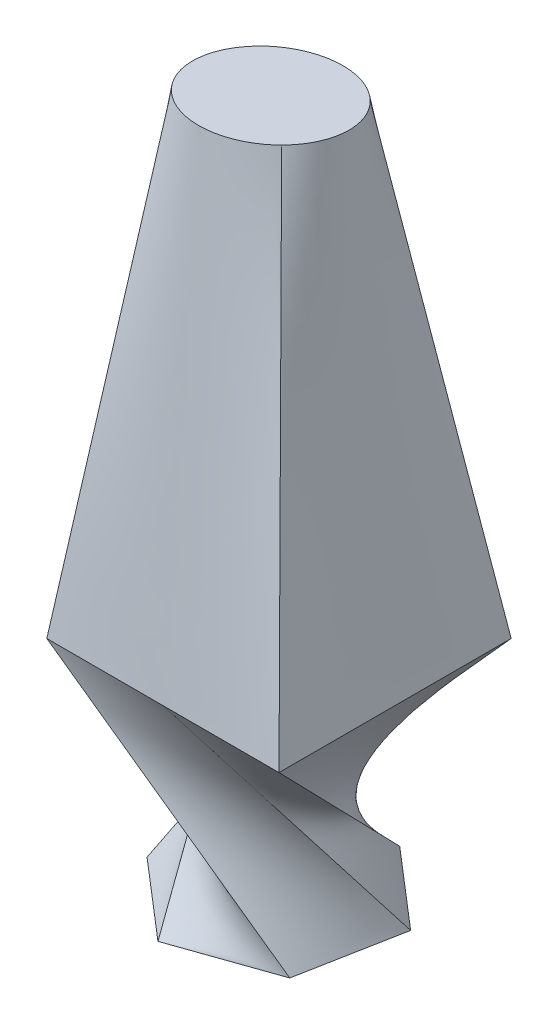
ISO-10303-21;
HEADER;
FILE_DESCRIPTION(('STEP AP214'),'2;1');
FILE_NAME('part.step','',(''),(''),'','','');
FILE_SCHEMA(('AUTOMOTIVE_DESIGN { 1 0 10303 214 1 1 1 1 }'));
ENDSEC;
DATA;
#1=APPLICATION_CONTEXT('core data for automotive mechanical design processes');
#2=APPLICATION_PROTOCOL_DEFINITION('international standard','automotive_design',2000,#1);
#3=PRODUCT_CONTEXT('',#1,'mechanical');
#4=PRODUCT('Part','Part','',(#3));
#5=PRODUCT_RELATED_PRODUCT_CATEGORY('part','',(#4));
#6=PRODUCT_DEFINITION_FORMATION('','',#4);
#7=PRODUCT_DEFINITION_CONTEXT('part definition',#1,'design');
#8=PRODUCT_DEFINITION('design','',#6,#7);
#9=PRODUCT_DEFINITION_SHAPE('','',#8);
#10=(LENGTH_UNIT() NAMED_UNIT(*) SI_UNIT(.MILLI.,.METRE.));
#11=(NAMED_UNIT(*) PLANE_ANGLE_UNIT() SI_UNIT($,.RADIAN.));
#12=(NAMED_UNIT(*) SI_UNIT($,.STERADIAN.) SOLID_ANGLE_UNIT());
#13=UNCERTAINTY_MEASURE_WITH_UNIT(LENGTH_MEASURE(1.E-05),#10,'distance_accuracy_value','');
#14=(GEOMETRIC_REPRESENTATION_CONTEXT(3) GLOBAL_UNCERTAINTY_ASSIGNED_CONTEXT((#13)) GLOBAL_UNIT_ASSIGNED_CONTEXT((#10,
#11,#12)) REPRESENTATION_CONTEXT('',''));
#15=CARTESIAN_POINT('',(0.,0.,0.));
#16=DIRECTION('',(0.,0.,1.));
#17=DIRECTION('',(1.,0.,0.));
#18=AXIS2_PLACEMENT_3D('',#15,#16,#17);
#19=CARTESIAN_POINT('',(5.75967949876772,100.,2.47246973523809));
#20=DIRECTION('',(0.,1.,0.));
#21=DIRECTION('',(0.,0.,1.));
#22=AXIS2_PLACEMENT_3D('',#19,#20,#21);
#23=PLANE('',#22);
#24=CARTESIAN_POINT('',(5.75967949876772,100.,2.47246973523809));
#25=DIRECTION('',(0.,1.,0.));
#26=DIRECTION('',(0.892827172879667,0.,-0.450399422033046));
#27=AXIS2_PLACEMENT_3D('',#24,#25,#26);
#28=ELLIPSE('',#27,15.3774135941659,12.7880862975647);
#29=CARTESIAN_POINT('',(-4.65101371843553,100.,-5.59238115716315));
#30=VERTEX_POINT('',#29);
#31=CARTESIAN_POINT('',(-5.96029484084761,100.,12.1687105106719));
#32=VERTEX_POINT('',#31);
#33=EDGE_CURVE('E107',#30,#32,#28,.T.);
#34=ORIENTED_EDGE('',*,*,#33,.T.);
#35=CARTESIAN_POINT('',(16.170372715971,100.,10.5373206276393));
#36=VERTEX_POINT('',#35);
#37=EDGE_CURVE('E252',#32,#36,#28,.T.);
#38=ORIENTED_EDGE('',*,*,#37,.T.);
#39=CARTESIAN_POINT('',(17.479653838383,100.,-7.2237710401957));
#40=VERTEX_POINT('',#39);
#41=EDGE_CURVE('E244',#36,#40,#28,.T.);
#42=ORIENTED_EDGE('',*,*,#41,.T.);
#43=EDGE_CURVE('E253',#40,#30,#28,.T.);
#44=ORIENTED_EDGE('',*,*,#43,.T.);
#45=EDGE_LOOP('',(#34,#38,#42,#44));
#46=FACE_BOUND('',#45,.T.);
#47=ADVANCED_FACE('F79',(#46),#23,.T.);
#48=CARTESIAN_POINT('',(16.170372715971,100.,10.5373206276393));
#49=CARTESIAN_POINT('',(32.9094123068504,0.,27.8481012658228));
#50=CARTESIAN_POINT('',(15.5097309400779,100.,11.1979624035324));
#51=CARTESIAN_POINT('',(30.8260789735171,0.,27.8481012658228));
#52=CARTESIAN_POINT('',(14.7604311117545,100.,11.8398617789833));
#53=CARTESIAN_POINT('',(28.7427456401838,0.,27.8481012658228));
#54=CARTESIAN_POINT('',(13.0937994361936,100.,13.0304037317787));
#55=CARTESIAN_POINT('',(24.5760789735172,0.,27.8481012658228));
#56=CARTESIAN_POINT('',(12.1763269192082,100.,13.578646212666));
#57=CARTESIAN_POINT('',(22.4927456401838,0.,27.8481012658228));
#58=CARTESIAN_POINT('',(10.2102410521367,100.,14.5224451618333));
#59=CARTESIAN_POINT('',(18.3260789735172,0.,27.8481012658228));
#60=CARTESIAN_POINT('',(9.16181577734206,100.,14.9174867262341));
#61=CARTESIAN_POINT('',(16.2427456401839,0.,27.8481012658228));
#62=CARTESIAN_POINT('',(6.99879125221362,100.,15.5064411925035));
#63=CARTESIAN_POINT('',(12.0760789735172,0.,27.8481012658228));
#64=CARTESIAN_POINT('',(5.88472911399291,100.,15.6999598269453));
#65=CARTESIAN_POINT('',(9.99274564018388,0.,27.8481012658228));
#66=CARTESIAN_POINT('',(3.6724461422346,100.,15.8630410376347));
#67=CARTESIAN_POINT('',(5.82607897351721,0.,27.8481012658228));
#68=CARTESIAN_POINT('',(2.57489685464184,100.,15.8325541100318));
#69=CARTESIAN_POINT('',(3.74274564018387,0.,27.8481012658228));
#70=CARTESIAN_POINT('',(0.475541222099772,100.,15.5578063367602));
#71=CARTESIAN_POINT('',(-0.423921026482805,0.,27.8481012658228));
#72=CARTESIAN_POINT('',(-0.525780586847373,100.,15.3138644464477));
#73=CARTESIAN_POINT('',(-2.50725435981614,0.,27.8481012658228));
#74=CARTESIAN_POINT('',(-2.37344405170675,100.,14.6512008069388));
#75=CARTESIAN_POINT('',(-6.67392102648283,0.,27.8481012658228));
#76=CARTESIAN_POINT('',(-3.21967190546853,100.,14.2329717083479));
#77=CARTESIAN_POINT('',(-8.75725435981618,0.,27.8481012658228));
#78=CARTESIAN_POINT('',(-4.72803217707021,100.,13.2764782643926));
#79=CARTESIAN_POINT('',(-12.9239210264829,0.,27.8481012658228));
#80=CARTESIAN_POINT('',(-5.39036611135035,100.,12.7386392401691));
#81=CARTESIAN_POINT('',(-15.0072543598162,0.,27.8481012658228));
#82=CARTESIAN_POINT('',(-5.96029484084761,100.,12.1687105106719));
#83=CARTESIAN_POINT('',(-17.0905876931496,0.,27.8481012658228));
#84=B_SPLINE_SURFACE_WITH_KNOTS('',3,1,((#48,#49),(#50,#51),(#52,#53),(#54,#55),(#56,#57),(#58,
#59),(#60,#61),(#62,#63),(#64,#65),(#66,#67),(#68,#69),(#70,#71),(#72,#73),(#74,#75),(#76,#77),
(#78,#79),(#80,#81),(#82,#83)),.UNSPECIFIED.,.F.,.F.,.F.,(4,2,2,2,2,2,2,2,4),(2,2),(0.,0.125,
0.25,0.375,0.5,0.625,0.75,0.875,1.),(0.,1.),.UNSPECIFIED.);
#85=DIRECTION('',(-0.109300698108646,-0.982010981732975,0.153973339084407));
#86=VECTOR('',#85,1.);
#87=CARTESIAN_POINT('',(-11.5254412669986,50.,20.0084058882473));
#88=LINE('',#87,#86);
#89=CARTESIAN_POINT('',(-17.0905876931496,0.,27.8481012658228));
#90=VERTEX_POINT('',#89);
#91=EDGE_CURVE('E270',#32,#90,#88,.T.);
#92=DIRECTION('',(1.,0.,0.));
#93=VECTOR('',#92,1.);
#94=CARTESIAN_POINT('',(-17.0905876931496,0.,27.8481012658228));
#95=LINE('',#94,#93);
#96=CARTESIAN_POINT('',(7.90941230685039,0.,27.8481012658228));
#97=VERTEX_POINT('',#96);
#98=EDGE_CURVE('E335',#90,#97,#95,.T.);
#99=DIRECTION('',(-1.,0.,0.));
#100=VECTOR('',#99,1.);
#101=CARTESIAN_POINT('',(-17.0905876931496,0.,27.8481012658228));
#102=LINE('',#101,#100);
#103=CARTESIAN_POINT('',(32.9094123068504,0.,27.8481012658228));
#104=VERTEX_POINT('',#103);
#105=EDGE_CURVE('E182',#104,#97,#102,.T.);
#106=DIRECTION('',(-0.162738611193536,0.972209966467892,-0.168297134637814));
#107=VECTOR('',#106,1.);
#108=CARTESIAN_POINT('',(24.5398925114107,50.,19.1927109467311));
#109=LINE('',#108,#107);
#110=EDGE_CURVE('E268',#104,#36,#109,.T.);
#111=ORIENTED_EDGE('',*,*,#37,.F.);
#112=ORIENTED_EDGE('',*,*,#91,.T.);
#113=ORIENTED_EDGE('',*,*,#98,.T.);
#114=ORIENTED_EDGE('',*,*,#105,.F.);
#115=ORIENTED_EDGE('',*,*,#110,.T.);
#116=EDGE_LOOP('',(#111,#112,#113,#114,#115));
#117=FACE_BOUND('',#116,.T.);
#118=ADVANCED_FACE('F221',(#117),#84,.T.);
#119=CARTESIAN_POINT('',(-5.96029484084761,100.,12.1687105106719));
#120=CARTESIAN_POINT('',(-17.0905876931496,0.,27.8481012658228));
#121=CARTESIAN_POINT('',(-6.47086816501145,100.,11.658137186508));
#122=CARTESIAN_POINT('',(-17.0905876931496,0.,25.7647679324894));
#123=CARTESIAN_POINT('',(-6.9433827627682,100.,11.0857564291235));
#124=CARTESIAN_POINT('',(-17.0905876931496,0.,23.6814345991561));
#125=CARTESIAN_POINT('',(-7.77285194402823,100.,9.82483852302612));
#126=CARTESIAN_POINT('',(-17.0905876931496,0.,19.5147679324894));
#127=CARTESIAN_POINT('',(-8.12956002463382,100.,9.13626213958353));
#128=CARTESIAN_POINT('',(-17.0905876931496,0.,17.4314345991561));
#129=CARTESIAN_POINT('',(-8.69144917362927,100.,7.66470101168355));
#130=CARTESIAN_POINT('',(-17.0905876931496,0.,13.2647679324894));
#131=CARTESIAN_POINT('',(-8.89638571463439,100.,6.88180514527687));
#132=CARTESIAN_POINT('',(-17.0905876931496,0.,11.1814345991561));
#133=CARTESIAN_POINT('',(-9.13027929656452,100.,5.25729120726923));
#134=CARTESIAN_POINT('',(-17.0905876931496,0.,7.01476793248939));
#135=CARTESIAN_POINT('',(-9.15909031515034,100.,4.41588950782027));
#136=CARTESIAN_POINT('',(-17.0905876931496,0.,4.93143459915606));
#137=CARTESIAN_POINT('',(-9.03402721919322,100.,2.71934239235783));
#138=CARTESIAN_POINT('',(-17.0905876931496,0.,0.764767932489389));
#139=CARTESIAN_POINT('',(-8.8801736247326,100.,1.86447534212599));
#140=CARTESIAN_POINT('',(-17.0905876931496,0.,-1.31856540084394));
#141=CARTESIAN_POINT('',(-8.40290939004147,100.,0.187537514766762));
#142=CARTESIAN_POINT('',(-17.0905876931496,0.,-5.48523206751061));
#143=CARTESIAN_POINT('',(-8.07967844240157,100.,-0.634292879724528));
#144=CARTESIAN_POINT('',(-17.0905876931496,0.,-7.56856540084394));
#145=CARTESIAN_POINT('',(-7.29350787702682,100.,-2.20522791824429));
#146=CARTESIAN_POINT('',(-17.0905876931496,0.,-11.7352320675106));
#147=CARTESIAN_POINT('',(-6.83082863387109,100.,-2.95420646474127));
#148=CARTESIAN_POINT('',(-17.0905876931496,0.,-13.8185654008439));
#149=CARTESIAN_POINT('',(-5.8053793803512,100.,-4.35186200699808));
#150=CARTESIAN_POINT('',(-17.0905876931496,0.,-17.9852320675106));
#151=CARTESIAN_POINT('',(-5.24285275047867,100.,-5.00054212512001));
#152=CARTESIAN_POINT('',(-17.0905876931496,0.,-20.0685654008439));
#153=CARTESIAN_POINT('',(-4.65101371843553,100.,-5.59238115716315));
#154=CARTESIAN_POINT('',(-17.0905876931496,0.,-22.1518987341772));
#155=B_SPLINE_SURFACE_WITH_KNOTS('',3,1,((#119,#120),(#121,#122),(#123,#124),(#125,#126),(#127,
#128),(#129,#130),(#131,#132),(#133,#134),(#135,#136),(#137,#138),(#139,#140),(#141,#142),(#143,
#144),(#145,#146),(#147,#148),(#149,#150),(#151,#152),(#153,#154)),.UNSPECIFIED.,.F.,.F.,.F.,(4,
2,2,2,2,2,2,2,4),(2,2),(0.,0.125,0.25,0.375,0.5,0.625,0.75,0.875,1.),(0.,1.),.UNSPECIFIED.);
#156=DIRECTION('',(-0.121810574992101,-0.979218221136075,-0.162153813446353));
#157=VECTOR('',#156,1.);
#158=CARTESIAN_POINT('',(-10.8708007057926,50.,-13.8721399456702));
#159=LINE('',#158,#157);
#160=CARTESIAN_POINT('',(-17.0905876931496,0.,-22.1518987341772));
#161=VERTEX_POINT('',#160);
#162=EDGE_CURVE('E275',#30,#161,#159,.T.);
#163=DIRECTION('',(0.,0.,1.));
#164=VECTOR('',#163,1.);
#165=CARTESIAN_POINT('',(-17.0905876931496,0.,-22.1518987341772));
#166=LINE('',#165,#164);
#167=EDGE_CURVE('E336',#161,#90,#166,.T.);
#168=ORIENTED_EDGE('',*,*,#33,.F.);
#169=ORIENTED_EDGE('',*,*,#162,.T.);
#170=ORIENTED_EDGE('',*,*,#167,.T.);
#171=ORIENTED_EDGE('',*,*,#91,.F.);
#172=EDGE_LOOP('',(#168,#169,#170,#171));
#173=FACE_BOUND('',#172,.T.);
#174=ADVANCED_FACE('F293',(#173),#155,.T.);
#175=CARTESIAN_POINT('',(17.479653838383,100.,-7.2237710401957));
#176=CARTESIAN_POINT('',(32.9094123068504,0.,-22.1518987341772));
#177=CARTESIAN_POINT('',(17.9902271625469,100.,-6.71319771603186));
#178=CARTESIAN_POINT('',(32.9094123068504,0.,-20.0685654008439));
#179=CARTESIAN_POINT('',(18.4627417603036,100.,-6.14081695864728));
#180=CARTESIAN_POINT('',(32.9094123068504,0.,-17.9852320675105));
#181=CARTESIAN_POINT('',(19.2922109415637,100.,-4.87989905254993));
#182=CARTESIAN_POINT('',(32.9094123068504,0.,-13.8185654008439));
#183=CARTESIAN_POINT('',(19.6489190221693,100.,-4.19132266910735));
#184=CARTESIAN_POINT('',(32.9094123068504,0.,-11.7352320675105));
#185=CARTESIAN_POINT('',(20.2108081711647,100.,-2.71976154120736));
#186=CARTESIAN_POINT('',(32.9094123068504,0.,-7.56856540084386));
#187=CARTESIAN_POINT('',(20.4157447121698,100.,-1.93686567480068));
#188=CARTESIAN_POINT('',(32.9094123068504,0.,-5.48523206751053));
#189=CARTESIAN_POINT('',(20.6496382941,100.,-0.312351736793042));
#190=CARTESIAN_POINT('',(32.9094123068504,0.,-1.31856540084386));
#191=CARTESIAN_POINT('',(20.6784493126858,100.,0.529049962655916));
#192=CARTESIAN_POINT('',(32.9094123068504,0.,0.76476793248947));
#193=CARTESIAN_POINT('',(20.5533862167287,100.,2.22559707811835));
#194=CARTESIAN_POINT('',(32.9094123068504,0.,4.93143459915613));
#195=CARTESIAN_POINT('',(20.399532622268,100.,3.0804641283502));
#196=CARTESIAN_POINT('',(32.9094123068504,0.,7.01476793248947));
#197=CARTESIAN_POINT('',(19.9222683875769,100.,4.75740195570943));
#198=CARTESIAN_POINT('',(32.9094123068504,0.,11.1814345991561));
#199=CARTESIAN_POINT('',(19.599037439937,100.,5.57923235020072));
#200=CARTESIAN_POINT('',(32.9094123068504,0.,13.2647679324895));
#201=CARTESIAN_POINT('',(18.8128668745623,100.,7.15016738872048));
#202=CARTESIAN_POINT('',(32.9094123068504,0.,17.4314345991561));
#203=CARTESIAN_POINT('',(18.3501876314065,100.,7.89914593521745));
#204=CARTESIAN_POINT('',(32.9094123068504,0.,19.5147679324895));
#205=CARTESIAN_POINT('',(17.3247383778866,100.,9.29680147747427));
#206=CARTESIAN_POINT('',(32.9094123068504,0.,23.6814345991561));
#207=CARTESIAN_POINT('',(16.7622117480141,100.,9.9454815955962));
#208=CARTESIAN_POINT('',(32.9094123068504,0.,25.7647679324895));
#209=CARTESIAN_POINT('',(16.170372715971,100.,10.5373206276393));
#210=CARTESIAN_POINT('',(32.9094123068504,0.,27.8481012658228));
#211=B_SPLINE_SURFACE_WITH_KNOTS('',3,1,((#175,#176),(#177,#178),(#179,#180),(#181,#182),(#183,
#184),(#185,#186),(#187,#188),(#189,#190),(#191,#192),(#193,#194),(#195,#196),(#197,#198),(#199,
#200),(#201,#202),(#203,#204),(#205,#206),(#207,#208),(#209,#210)),.UNSPECIFIED.,.F.,.F.,.F.,(4,
2,2,2,2,2,2,2,4),(2,2),(0.,0.125,0.25,0.375,0.5,0.625,0.75,0.875,1.),(0.,1.),.UNSPECIFIED.);
#212=DIRECTION('',(0.,0.,-1.));
#213=VECTOR('',#212,1.);
#214=CARTESIAN_POINT('',(32.9094123068504,0.,-22.1518987341772));
#215=LINE('',#214,#213);
#216=CARTESIAN_POINT('',(32.9094123068504,0.,-22.1518987341772));
#217=VERTEX_POINT('',#216);
#218=EDGE_CURVE('E91',#104,#217,#215,.T.);
#219=DIRECTION('',(0.150859982735264,-0.977720960723817,-0.145955433507674));
#220=VECTOR('',#219,1.);
#221=CARTESIAN_POINT('',(25.1945330726167,50.,-14.6878348871865));
#222=LINE('',#221,#220);
#223=EDGE_CURVE('E333',#40,#217,#222,.T.);
#224=ORIENTED_EDGE('',*,*,#41,.F.);
#225=ORIENTED_EDGE('',*,*,#110,.F.);
#226=ORIENTED_EDGE('',*,*,#218,.T.);
#227=ORIENTED_EDGE('',*,*,#223,.F.);
#228=EDGE_LOOP('',(#224,#225,#226,#227));
#229=FACE_BOUND('',#228,.T.);
#230=ADVANCED_FACE('F303',(#229),#211,.T.);
#231=CARTESIAN_POINT('',(-4.65101371843553,100.,-5.59238115716315));
#232=CARTESIAN_POINT('',(-17.0905876931496,0.,-22.1518987341772));
#233=CARTESIAN_POINT('',(-3.99037194254246,100.,-6.25302293305622));
#234=CARTESIAN_POINT('',(-15.0072543598162,0.,-22.1518987341772));
#235=CARTESIAN_POINT('',(-3.24107211421903,100.,-6.89492230850707));
#236=CARTESIAN_POINT('',(-12.9239210264829,0.,-22.1518987341772));
#237=CARTESIAN_POINT('',(-1.57444043865814,100.,-8.08546426130255));
#238=CARTESIAN_POINT('',(-8.75725435981625,0.,-22.1518987341772));
#239=CARTESIAN_POINT('',(-0.656967921672754,100.,-8.63370674218979));
#240=CARTESIAN_POINT('',(-6.67392102648292,0.,-22.1518987341772));
#241=CARTESIAN_POINT('',(1.30911794539876,100.,-9.57750569135713));
#242=CARTESIAN_POINT('',(-2.50725435981626,0.,-22.1518987341772));
#243=CARTESIAN_POINT('',(2.35754322019338,100.,-9.97254725575791));
#244=CARTESIAN_POINT('',(-0.423921026482923,0.,-22.1518987341772));
#245=CARTESIAN_POINT('',(4.52056774532182,100.,-10.5615017220274));
#246=CARTESIAN_POINT('',(3.74274564018374,0.,-22.1518987341772));
#247=CARTESIAN_POINT('',(5.63462988354253,100.,-10.7550203564691));
#248=CARTESIAN_POINT('',(5.82607897351707,0.,-22.1518987341772));
#249=CARTESIAN_POINT('',(7.84691285530084,100.,-10.9181015671585));
#250=CARTESIAN_POINT('',(9.99274564018374,0.,-22.1518987341772));
#251=CARTESIAN_POINT('',(8.9444621428936,100.,-10.8876146395557));
#252=CARTESIAN_POINT('',(12.0760789735171,0.,-22.1518987341772));
#253=CARTESIAN_POINT('',(11.0438177754357,100.,-10.612866866284));
#254=CARTESIAN_POINT('',(16.2427456401837,0.,-22.1518987341772));
#255=CARTESIAN_POINT('',(12.0451395843828,100.,-10.3689249759716));
#256=CARTESIAN_POINT('',(18.3260789735171,0.,-22.1518987341772));
#257=CARTESIAN_POINT('',(13.8928030492422,100.,-9.70626133646266));
#258=CARTESIAN_POINT('',(22.4927456401837,0.,-22.1518987341772));
#259=CARTESIAN_POINT('',(14.739030903004,100.,-9.28803223787175));
#260=CARTESIAN_POINT('',(24.5760789735171,0.,-22.1518987341772));
#261=CARTESIAN_POINT('',(16.2473911746057,100.,-8.33153879391643));
#262=CARTESIAN_POINT('',(28.7427456401838,0.,-22.1518987341772));
#263=CARTESIAN_POINT('',(16.9097251088858,100.,-7.79369976969296));
#264=CARTESIAN_POINT('',(30.8260789735171,0.,-22.1518987341772));
#265=CARTESIAN_POINT('',(17.479653838383,100.,-7.2237710401957));
#266=CARTESIAN_POINT('',(32.9094123068504,0.,-22.1518987341772));
#267=B_SPLINE_SURFACE_WITH_KNOTS('',3,1,((#231,#232),(#233,#234),(#235,#236),(#237,#238),(#239,
#240),(#241,#242),(#243,#244),(#245,#246),(#247,#248),(#249,#250),(#251,#252),(#253,#254),(#255,
#256),(#257,#258),(#259,#260),(#261,#262),(#263,#264),(#265,#266)),.UNSPECIFIED.,.F.,.F.,.F.,(4,
2,2,2,2,2,2,2,4),(2,2),(0.,0.125,0.25,0.375,0.5,0.625,0.75,0.875,1.),(0.,1.),.UNSPECIFIED.);
#268=DIRECTION('',(-1.,0.,0.));
#269=VECTOR('',#268,1.);
#270=CARTESIAN_POINT('',(-17.0905876931496,0.,-22.1518987341772));
#271=LINE('',#270,#269);
#272=CARTESIAN_POINT('',(7.90941230685041,0.,-22.1518987341772));
#273=VERTEX_POINT('',#272);
#274=EDGE_CURVE('E12',#217,#273,#271,.T.);
#275=DIRECTION('',(1.,0.,0.));
#276=VECTOR('',#275,1.);
#277=CARTESIAN_POINT('',(-17.0905876931496,0.,-22.1518987341772));
#278=LINE('',#277,#276);
#279=EDGE_CURVE('E347',#161,#273,#278,.T.);
#280=ORIENTED_EDGE('',*,*,#43,.F.);
#281=ORIENTED_EDGE('',*,*,#223,.T.);
#282=ORIENTED_EDGE('',*,*,#274,.T.);
#283=ORIENTED_EDGE('',*,*,#279,.F.);
#284=ORIENTED_EDGE('',*,*,#162,.F.);
#285=EDGE_LOOP('',(#280,#281,#282,#283,#284));
#286=FACE_BOUND('',#285,.T.);
#287=ADVANCED_FACE('F81',(#286),#267,.T.);
#288=CARTESIAN_POINT('',(0.,-50.,0.));
#289=DIRECTION('',(0.,1.,0.));
#290=DIRECTION('',(0.,0.,1.));
#291=AXIS2_PLACEMENT_3D('',#288,#289,#290);
#292=PLANE('',#291);
#293=DIRECTION('',(0.185991979934537,0.,-0.982551262479486));
#294=VECTOR('',#293,1.);
#295=CARTESIAN_POINT('',(22.3775460318154,-50.,15.0018177586158));
#296=LINE('',#295,#294);
#297=CARTESIAN_POINT('',(22.3775460318154,-50.,15.0018177586158));
#298=VERTEX_POINT('',#297);
#299=CARTESIAN_POINT('',(26.520546939589,-50.,-6.88466774371269));
#300=VERTEX_POINT('',#299);
#301=EDGE_CURVE('E156',#298,#300,#296,.T.);
#302=ORIENTED_EDGE('',*,*,#301,.F.);
#303=DIRECTION('',(0.943910343794975,0.,-0.330201851716267));
#304=VECTOR('',#303,1.);
#305=CARTESIAN_POINT('',(1.3517931333522,-50.,22.3571164757461));
#306=LINE('',#305,#304);
#307=CARTESIAN_POINT('',(1.3517931333522,-50.,22.3571164757461));
#308=VERTEX_POINT('',#307);
#309=EDGE_CURVE('E361',#308,#298,#306,.T.);
#310=ORIENTED_EDGE('',*,*,#309,.F.);
#311=DIRECTION('',(0.757918363860437,0.,0.652349410763219));
#312=VECTOR('',#311,1.);
#313=CARTESIAN_POINT('',(-15.5309588573373,-50.,7.82592969054786));
#314=LINE('',#313,#312);
#315=CARTESIAN_POINT('',(-15.5309588573373,-50.,7.82592969054786));
#316=VERTEX_POINT('',#315);
#317=EDGE_CURVE('E373',#316,#308,#314,.T.);
#318=ORIENTED_EDGE('',*,*,#317,.F.);
#319=DIRECTION('',(-0.185991979934539,0.,0.982551262479485));
#320=VECTOR('',#319,1.);
#321=CARTESIAN_POINT('',(-11.3879579495636,-50.,-14.0605558117806));
#322=LINE('',#321,#320);
#323=CARTESIAN_POINT('',(-11.3879579495636,-50.,-14.0605558117806));
#324=VERTEX_POINT('',#323);
#325=EDGE_CURVE('E425',#324,#316,#322,.T.);
#326=ORIENTED_EDGE('',*,*,#325,.F.);
#327=DIRECTION('',(-0.943910343794976,0.,0.330201851716266));
#328=VECTOR('',#327,1.);
#329=CARTESIAN_POINT('',(9.63779494889952,-50.,-21.4158545289109));
#330=LINE('',#329,#328);
#331=CARTESIAN_POINT('',(9.63779494889952,-50.,-21.4158545289109));
#332=VERTEX_POINT('',#331);
#333=EDGE_CURVE('E158',#332,#324,#330,.T.);
#334=ORIENTED_EDGE('',*,*,#333,.F.);
#335=DIRECTION('',(-0.757918363860437,0.,-0.652349410763219));
#336=VECTOR('',#335,1.);
#337=CARTESIAN_POINT('',(26.520546939589,-50.,-6.88466774371269));
#338=LINE('',#337,#336);
#339=EDGE_CURVE('E152',#300,#332,#338,.T.);
#340=ORIENTED_EDGE('',*,*,#339,.F.);
#341=EDGE_LOOP('',(#302,#310,#318,#326,#334,#340));
#342=FACE_BOUND('',#341,.T.);
#343=ADVANCED_FACE('F155',(#342),#292,.F.);
#344=CARTESIAN_POINT('',(-11.3879579495636,-50.,-14.0605558117806));
#345=CARTESIAN_POINT('',(32.9094123068504,0.,-22.1518987341772));
#346=CARTESIAN_POINT('',(-12.0784581008592,-50.,-10.4128082280593));
#347=CARTESIAN_POINT('',(28.7427456401837,0.,-22.1518987341772));
#348=CARTESIAN_POINT('',(-12.7689582521548,-50.,-6.76506064433785));
#349=CARTESIAN_POINT('',(24.5760789735171,0.,-22.1518987341772));
#350=CARTESIAN_POINT('',(-14.149958554746,-50.,0.53043452310498));
#351=CARTESIAN_POINT('',(16.2427456401837,0.,-22.1518987341772));
#352=CARTESIAN_POINT('',(-14.8404587060416,-50.,4.17818210682641));
#353=CARTESIAN_POINT('',(12.0760789735171,0.,-22.1518987341772));
#354=CARTESIAN_POINT('',(-15.5309588573373,-50.,7.82592969054785));
#355=CARTESIAN_POINT('',(7.90941230685041,0.,-22.1518987341772));
#356=B_SPLINE_SURFACE_WITH_KNOTS('',3,1,((#344,#345),(#346,#347),(#348,#349),(#350,#351),(#352,
#353),(#354,#355)),.UNSPECIFIED.,.F.,.F.,.F.,(4,2,4),(2,2),(0.,0.5,1.),(0.,1.),.UNSPECIFIED.);
#357=DIRECTION('',(0.373051891384975,0.795746553610307,-0.477095073073922));
#358=VECTOR('',#357,1.);
#359=CARTESIAN_POINT('',(-3.81077327524342,-25.,-7.16298452181469));
#360=LINE('',#359,#358);
#361=EDGE_CURVE('E349',#316,#273,#360,.T.);
#362=DIRECTION('',(-0.658321192218456,-0.743070286574331,0.120248730082328));
#363=VECTOR('',#362,1.);
#364=CARTESIAN_POINT('',(10.7607271786434,-25.,-18.1062272729789));
#365=LINE('',#364,#363);
#366=EDGE_CURVE('E99',#217,#324,#365,.T.);
#367=ORIENTED_EDGE('',*,*,#325,.T.);
#368=ORIENTED_EDGE('',*,*,#361,.T.);
#369=ORIENTED_EDGE('',*,*,#274,.F.);
#370=ORIENTED_EDGE('',*,*,#366,.T.);
#371=EDGE_LOOP('',(#367,#368,#369,#370));
#372=FACE_BOUND('',#371,.T.);
#373=ADVANCED_FACE('F392',(#372),#356,.T.);
#374=CARTESIAN_POINT('',(-15.5309588573373,-50.,7.82592969054786));
#375=CARTESIAN_POINT('',(7.90941230685041,0.,-22.1518987341772));
#376=CARTESIAN_POINT('',(-12.717166858889,-50.,10.2477941547476));
#377=CARTESIAN_POINT('',(3.74274564018375,0.,-22.1518987341772));
#378=CARTESIAN_POINT('',(-9.90337486044076,-50.,12.6696586189473));
#379=CARTESIAN_POINT('',(-0.423921026482921,0.,-22.1518987341772));
#380=CARTESIAN_POINT('',(-4.27579086354427,-50.,17.5133875473467));
#381=CARTESIAN_POINT('',(-8.75725435981625,0.,-22.1518987341772));
#382=CARTESIAN_POINT('',(-1.46199886509604,-50.,19.9352520115464));
#383=CARTESIAN_POINT('',(-12.9239210264829,0.,-22.1518987341772));
#384=CARTESIAN_POINT('',(1.3517931333522,-50.,22.3571164757461));
#385=CARTESIAN_POINT('',(-17.0905876931496,0.,-22.1518987341772));
#386=B_SPLINE_SURFACE_WITH_KNOTS('',3,1,((#374,#375),(#376,#377),(#378,#379),(#380,#381),(#382,
#383),(#384,#385)),.UNSPECIFIED.,.F.,.F.,.F.,(4,2,4),(2,2),(0.,0.5,1.),(0.,1.),.UNSPECIFIED.);
#387=DIRECTION('',(-0.265607656385452,0.720101322286364,-0.641020014126593));
#388=VECTOR('',#387,1.);
#389=CARTESIAN_POINT('',(-7.86939727989869,-25.,0.102608870784424));
#390=LINE('',#389,#388);
#391=EDGE_CURVE('E186',#308,#161,#390,.T.);
#392=ORIENTED_EDGE('',*,*,#317,.T.);
#393=ORIENTED_EDGE('',*,*,#391,.T.);
#394=ORIENTED_EDGE('',*,*,#279,.T.);
#395=ORIENTED_EDGE('',*,*,#361,.F.);
#396=EDGE_LOOP('',(#392,#393,#394,#395));
#397=FACE_BOUND('',#396,.T.);
#398=ADVANCED_FACE('F380',(#397),#386,.T.);
#399=CARTESIAN_POINT('',(9.63779494889952,-50.,-21.4158545289109));
#400=CARTESIAN_POINT('',(32.9094123068504,0.,27.8481012658228));
#401=CARTESIAN_POINT('',(6.13350279915567,-50.,-20.1899714093892));
#402=CARTESIAN_POINT('',(32.9094123068504,0.,19.5147679324895));
#403=CARTESIAN_POINT('',(2.62921064941182,-50.,-18.9640882898675));
#404=CARTESIAN_POINT('',(32.9094123068504,0.,11.1814345991561));
#405=CARTESIAN_POINT('',(-4.37937365007589,-50.,-16.5123220508241));
#406=CARTESIAN_POINT('',(32.9094123068504,0.,-5.48523206751054));
#407=CARTESIAN_POINT('',(-7.88366579981974,-50.,-15.2864389313023));
#408=CARTESIAN_POINT('',(32.9094123068504,0.,-13.8185654008439));
#409=CARTESIAN_POINT('',(-11.3879579495636,-50.,-14.0605558117806));
#410=CARTESIAN_POINT('',(32.9094123068504,0.,-22.1518987341772));
#411=B_SPLINE_SURFACE_WITH_KNOTS('',3,1,((#399,#400),(#401,#402),(#403,#404),(#405,#406),(#407,
#408),(#409,#410)),.UNSPECIFIED.,.F.,.F.,.F.,(4,2,4),(2,2),(0.,0.5,1.),(0.,1.),.UNSPECIFIED.);
#412=DIRECTION('',(0.314696737259584,0.676138517618042,0.666185160861039));
#413=VECTOR('',#412,1.);
#414=CARTESIAN_POINT('',(21.273603627875,-25.,3.21612336845594));
#415=LINE('',#414,#413);
#416=EDGE_CURVE('E184',#332,#104,#415,.T.);
#417=ORIENTED_EDGE('',*,*,#333,.T.);
#418=ORIENTED_EDGE('',*,*,#366,.F.);
#419=ORIENTED_EDGE('',*,*,#218,.F.);
#420=ORIENTED_EDGE('',*,*,#416,.F.);
#421=EDGE_LOOP('',(#417,#418,#419,#420));
#422=FACE_BOUND('',#421,.T.);
#423=ADVANCED_FACE('F391',(#422),#411,.T.);
#424=CARTESIAN_POINT('',(1.3517931333522,-50.,22.3571164757461));
#425=CARTESIAN_POINT('',(-17.0905876931496,0.,-22.1518987341772));
#426=CARTESIAN_POINT('',(4.85608528309605,-50.,21.1312333562244));
#427=CARTESIAN_POINT('',(-17.0905876931496,0.,-13.8185654008439));
#428=CARTESIAN_POINT('',(8.36037743283991,-50.,19.9053502367026));
#429=CARTESIAN_POINT('',(-17.0905876931496,0.,-5.48523206751052));
#430=CARTESIAN_POINT('',(15.3689617323276,-50.,17.4535839976592));
#431=CARTESIAN_POINT('',(-17.0905876931496,0.,11.1814345991561));
#432=CARTESIAN_POINT('',(18.8732538820715,-50.,16.2277008781375));
#433=CARTESIAN_POINT('',(-17.0905876931496,0.,19.5147679324895));
#434=CARTESIAN_POINT('',(22.3775460318154,-50.,15.0018177586158));
#435=CARTESIAN_POINT('',(-17.0905876931496,0.,27.8481012658228));
#436=B_SPLINE_SURFACE_WITH_KNOTS('',3,1,((#424,#425),(#426,#427),(#428,#429),(#430,#431),(#432,
#433),(#434,#435)),.UNSPECIFIED.,.F.,.F.,.F.,(4,2,4),(2,2),(0.,0.5,1.),(0.,1.),.UNSPECIFIED.);
#437=DIRECTION('',(-0.607363042090433,0.769434711966448,0.197687529004143));
#438=VECTOR('',#437,1.);
#439=CARTESIAN_POINT('',(2.6434791693329,-25.,21.4249595122193));
#440=LINE('',#439,#438);
#441=EDGE_CURVE('E175',#298,#90,#440,.T.);
#442=ORIENTED_EDGE('',*,*,#309,.T.);
#443=ORIENTED_EDGE('',*,*,#441,.T.);
#444=ORIENTED_EDGE('',*,*,#167,.F.);
#445=ORIENTED_EDGE('',*,*,#391,.F.);
#446=EDGE_LOOP('',(#442,#443,#444,#445));
#447=FACE_BOUND('',#446,.T.);
#448=ADVANCED_FACE('F405',(#447),#436,.T.);
#449=CARTESIAN_POINT('',(22.3775460318154,-50.,15.0018177586158));
#450=CARTESIAN_POINT('',(-17.0905876931496,0.,27.8481012658228));
#451=CARTESIAN_POINT('',(23.068046183111,-50.,11.3540701748943));
#452=CARTESIAN_POINT('',(-12.9239210264829,0.,27.8481012658228));
#453=CARTESIAN_POINT('',(23.7585463344066,-50.,7.70632259117294));
#454=CARTESIAN_POINT('',(-8.75725435981627,0.,27.8481012658228));
#455=CARTESIAN_POINT('',(25.1395466369978,-50.,0.410827423730119));
#456=CARTESIAN_POINT('',(-0.423921026482951,0.,27.8481012658228));
#457=CARTESIAN_POINT('',(25.8300467882934,-50.,-3.23692015999129));
#458=CARTESIAN_POINT('',(3.74274564018372,0.,27.8481012658228));
#459=CARTESIAN_POINT('',(26.520546939589,-50.,-6.88466774371269));
#460=CARTESIAN_POINT('',(7.90941230685039,0.,27.8481012658228));
#461=B_SPLINE_SURFACE_WITH_KNOTS('',3,1,((#449,#450),(#451,#452),(#453,#454),(#455,#456),(#457,
#458),(#459,#460)),.UNSPECIFIED.,.F.,.F.,.F.,(4,2,4),(2,2),(0.,0.5,1.),(0.,1.),.UNSPECIFIED.);
#462=DIRECTION('',(-0.292346906147626,0.785408605967962,0.54558831378373));
#463=VECTOR('',#462,1.);
#464=CARTESIAN_POINT('',(17.2149796232197,-25.,10.481716761055));
#465=LINE('',#464,#463);
#466=EDGE_CURVE('E172',#300,#97,#465,.T.);
#467=ORIENTED_EDGE('',*,*,#301,.T.);
#468=ORIENTED_EDGE('',*,*,#466,.T.);
#469=ORIENTED_EDGE('',*,*,#98,.F.);
#470=ORIENTED_EDGE('',*,*,#441,.F.);
#471=EDGE_LOOP('',(#467,#468,#469,#470));
#472=FACE_BOUND('',#471,.T.);
#473=ADVANCED_FACE('F171',(#472),#461,.T.);
#474=CARTESIAN_POINT('',(26.520546939589,-50.,-6.88466774371269));
#475=CARTESIAN_POINT('',(7.90941230685039,0.,27.8481012658228));
#476=CARTESIAN_POINT('',(23.7067549411407,-50.,-9.30653220791241));
#477=CARTESIAN_POINT('',(12.0760789735171,0.,27.8481012658228));
#478=CARTESIAN_POINT('',(20.8929629426925,-50.,-11.7283966721121));
#479=CARTESIAN_POINT('',(16.2427456401837,0.,27.8481012658228));
#480=CARTESIAN_POINT('',(15.265378945796,-50.,-16.5721256005115));
#481=CARTESIAN_POINT('',(24.5760789735171,0.,27.8481012658228));
#482=CARTESIAN_POINT('',(12.4515869473477,-50.,-18.9939900647112));
#483=CARTESIAN_POINT('',(28.7427456401837,0.,27.8481012658228));
#484=CARTESIAN_POINT('',(9.63779494889952,-50.,-21.4158545289109));
#485=CARTESIAN_POINT('',(32.9094123068504,0.,27.8481012658228));
#486=B_SPLINE_SURFACE_WITH_KNOTS('',3,1,((#474,#475),(#476,#477),(#478,#479),(#480,#481),(#482,
#483),(#484,#485)),.UNSPECIFIED.,.F.,.F.,.F.,(4,2,4),(2,2),(0.,0.5,1.),(0.,1.),.UNSPECIFIED.);
#487=ORIENTED_EDGE('',*,*,#339,.T.);
#488=ORIENTED_EDGE('',*,*,#416,.T.);
#489=ORIENTED_EDGE('',*,*,#105,.T.);
#490=ORIENTED_EDGE('',*,*,#466,.F.);
#491=EDGE_LOOP('',(#487,#488,#489,#490));
#492=FACE_BOUND('',#491,.T.);
#493=ADVANCED_FACE('F180',(#492),#486,.T.);
#494=CLOSED_SHELL('',(#47,#118,#174,#230,#287,#343,#373,#398,#423,#448,#473,#493));
#495=MANIFOLD_SOLID_BREP('B2',#494);
#496=ADVANCED_BREP_SHAPE_REPRESENTATION('',(#18,#495),#14);
#497=SHAPE_DEFINITION_REPRESENTATION(#9,#496);
ENDSEC;
END-ISO-10303-21;
